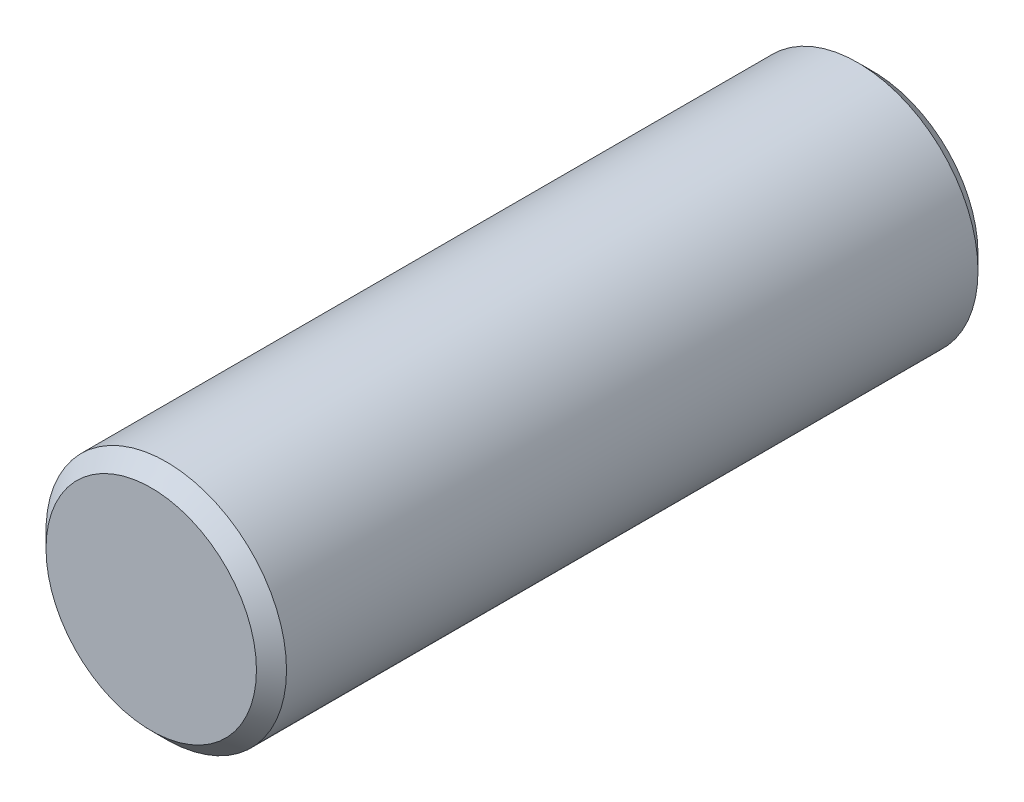
ISO-10303-21;
HEADER;
FILE_DESCRIPTION(('STEP AP214'),'2;1');
FILE_NAME('part.step','',(''),(''),'','','');
FILE_SCHEMA(('AUTOMOTIVE_DESIGN { 1 0 10303 214 1 1 1 1 }'));
ENDSEC;
DATA;
#1=APPLICATION_CONTEXT('core data for automotive mechanical design processes');
#2=APPLICATION_PROTOCOL_DEFINITION('international standard','automotive_design',2000,#1);
#3=PRODUCT_CONTEXT('',#1,'mechanical');
#4=PRODUCT('Part','Part','',(#3));
#5=PRODUCT_RELATED_PRODUCT_CATEGORY('part','',(#4));
#6=PRODUCT_DEFINITION_FORMATION('','',#4);
#7=PRODUCT_DEFINITION_CONTEXT('part definition',#1,'design');
#8=PRODUCT_DEFINITION('design','',#6,#7);
#9=PRODUCT_DEFINITION_SHAPE('','',#8);
#10=(LENGTH_UNIT() NAMED_UNIT(*) SI_UNIT(.MILLI.,.METRE.));
#11=(NAMED_UNIT(*) PLANE_ANGLE_UNIT() SI_UNIT($,.RADIAN.));
#12=(NAMED_UNIT(*) SI_UNIT($,.STERADIAN.) SOLID_ANGLE_UNIT());
#13=UNCERTAINTY_MEASURE_WITH_UNIT(LENGTH_MEASURE(1.E-05),#10,'distance_accuracy_value','');
#14=(GEOMETRIC_REPRESENTATION_CONTEXT(3) GLOBAL_UNCERTAINTY_ASSIGNED_CONTEXT((#13)) GLOBAL_UNIT_ASSIGNED_CONTEXT((#10,
#11,#12)) REPRESENTATION_CONTEXT('',''));
#15=CARTESIAN_POINT('',(0.,0.,0.));
#16=DIRECTION('',(0.,0.,1.));
#17=DIRECTION('',(1.,0.,0.));
#18=AXIS2_PLACEMENT_3D('',#15,#16,#17);
#19=CARTESIAN_POINT('',(0.,0.,-5.7500000000143));
#20=DIRECTION('',(0.,0.,1.));
#21=DIRECTION('',(1.,0.,0.));
#22=AXIS2_PLACEMENT_3D('',#19,#20,#21);
#23=CONICAL_SURFACE('',#22,1.99999999997295,0.785398163397449);
#24=CARTESIAN_POINT('',(0.,0.,-6.00000000000022));
#25=DIRECTION('',(0.,0.,1.));
#26=DIRECTION('',(1.,0.,0.));
#27=AXIS2_PLACEMENT_3D('',#24,#25,#26);
#28=CIRCLE('',#27,1.74999999998703);
#29=CARTESIAN_POINT('',(1.74999999998702,0.,-6.00000000000022));
#30=VERTEX_POINT('',#29);
#31=EDGE_CURVE('E50',#30,#30,#28,.T.);
#32=ORIENTED_EDGE('',*,*,#31,.T.);
#33=EDGE_LOOP('',(#32));
#34=FACE_BOUND('',#33,.T.);
#35=CARTESIAN_POINT('',(0.,0.,-5.7500000000143));
#36=DIRECTION('',(0.,0.,1.));
#37=DIRECTION('',(1.,0.,0.));
#38=AXIS2_PLACEMENT_3D('',#35,#36,#37);
#39=CIRCLE('',#38,1.99999999997295);
#40=CARTESIAN_POINT('',(1.99999999997294,0.,-5.7500000000143));
#41=VERTEX_POINT('',#40);
#42=EDGE_CURVE('E10',#41,#41,#39,.T.);
#43=ORIENTED_EDGE('',*,*,#42,.F.);
#44=EDGE_LOOP('',(#43));
#45=FACE_BOUND('',#44,.T.);
#46=ADVANCED_FACE('F36',(#34,#45),#23,.T.);
#47=CARTESIAN_POINT('',(0.,0.,-6.00000000000022));
#48=DIRECTION('',(0.,0.,1.));
#49=DIRECTION('',(1.,0.,0.));
#50=AXIS2_PLACEMENT_3D('',#47,#48,#49);
#51=CYLINDRICAL_SURFACE('',#50,1.99999999997294);
#52=ORIENTED_EDGE('',*,*,#42,.T.);
#53=EDGE_LOOP('',(#52));
#54=FACE_BOUND('',#53,.T.);
#55=CARTESIAN_POINT('',(0.,0.,5.74999999998566));
#56=DIRECTION('',(0.,0.,1.));
#57=DIRECTION('',(1.,0.,0.));
#58=AXIS2_PLACEMENT_3D('',#55,#56,#57);
#59=CIRCLE('',#58,1.99999999997294);
#60=CARTESIAN_POINT('',(1.99999999997294,0.,5.74999999998566));
#61=VERTEX_POINT('',#60);
#62=EDGE_CURVE('E42',#61,#61,#59,.T.);
#63=ORIENTED_EDGE('',*,*,#62,.F.);
#64=EDGE_LOOP('',(#63));
#65=FACE_BOUND('',#64,.T.);
#66=ADVANCED_FACE('F69',(#54,#65),#51,.T.);
#67=CARTESIAN_POINT('',(0.,0.,5.99999999999999));
#68=DIRECTION('',(0.,0.,-1.));
#69=DIRECTION('',(-1.,0.,0.));
#70=AXIS2_PLACEMENT_3D('',#67,#68,#69);
#71=CONICAL_SURFACE('',#70,1.74999999995862,0.785398163397446);
#72=ORIENTED_EDGE('',*,*,#62,.T.);
#73=EDGE_LOOP('',(#72));
#74=FACE_BOUND('',#73,.T.);
#75=CARTESIAN_POINT('',(0.,0.,5.99999999999999));
#76=DIRECTION('',(0.,0.,1.));
#77=DIRECTION('',(1.,0.,0.));
#78=AXIS2_PLACEMENT_3D('',#75,#76,#77);
#79=CIRCLE('',#78,1.74999999995862);
#80=CARTESIAN_POINT('',(1.74999999995861,0.,5.99999999999999));
#81=VERTEX_POINT('',#80);
#82=EDGE_CURVE('E46',#81,#81,#79,.T.);
#83=ORIENTED_EDGE('',*,*,#82,.F.);
#84=EDGE_LOOP('',(#83));
#85=FACE_BOUND('',#84,.T.);
#86=ADVANCED_FACE('F65',(#74,#85),#71,.T.);
#87=CARTESIAN_POINT('',(0.,0.,5.99999999999999));
#88=DIRECTION('',(0.,0.,1.));
#89=DIRECTION('',(1.,0.,0.));
#90=AXIS2_PLACEMENT_3D('',#87,#88,#89);
#91=PLANE('',#90);
#92=ORIENTED_EDGE('',*,*,#82,.T.);
#93=EDGE_LOOP('',(#92));
#94=FACE_BOUND('',#93,.T.);
#95=ADVANCED_FACE('F60',(#94),#91,.T.);
#96=CARTESIAN_POINT('',(1.74999999998702,0.,-6.00000000000022));
#97=DIRECTION('',(0.,0.,-1.));
#98=DIRECTION('',(-1.,0.,0.));
#99=AXIS2_PLACEMENT_3D('',#96,#97,#98);
#100=PLANE('',#99);
#101=ORIENTED_EDGE('',*,*,#31,.F.);
#102=EDGE_LOOP('',(#101));
#103=FACE_BOUND('',#102,.T.);
#104=ADVANCED_FACE('F58',(#103),#100,.T.);
#105=CLOSED_SHELL('',(#46,#66,#86,#95,#104));
#106=MANIFOLD_SOLID_BREP('B2',#105);
#107=ADVANCED_BREP_SHAPE_REPRESENTATION('',(#18,#106),#14);
#108=SHAPE_DEFINITION_REPRESENTATION(#9,#107);
ENDSEC;
END-ISO-10303-21;
